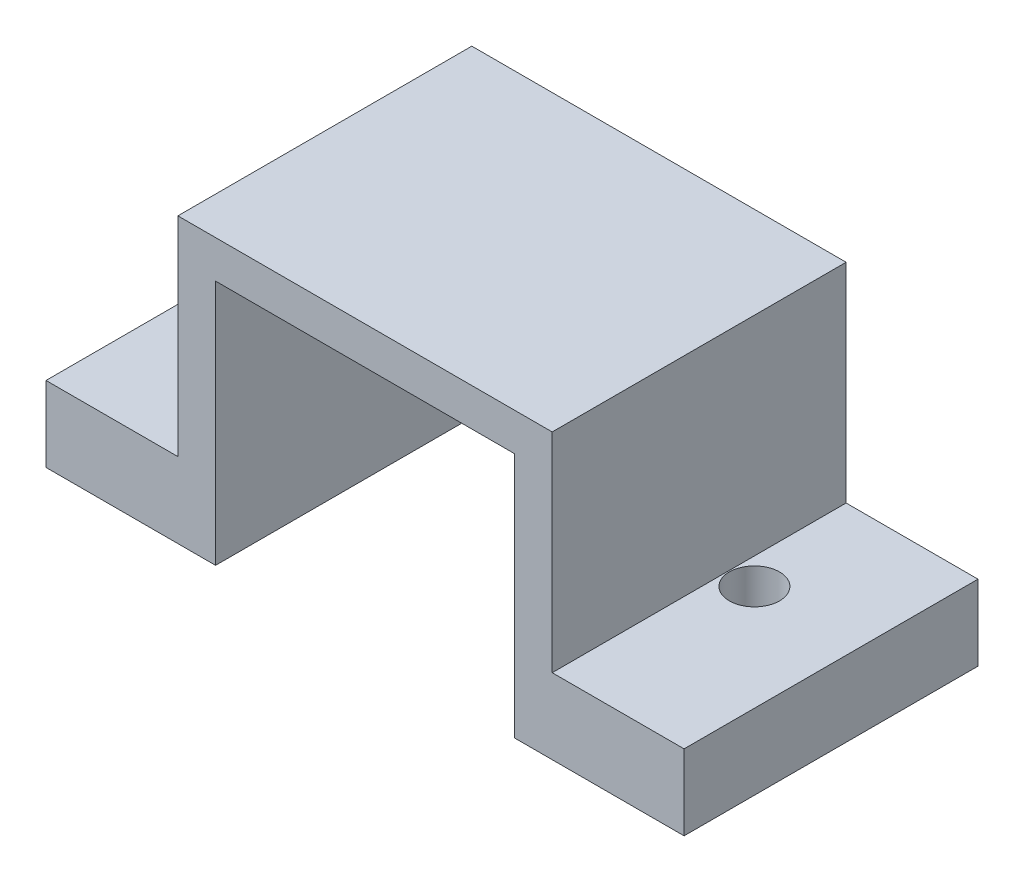
ISO-10303-21;
HEADER;
FILE_DESCRIPTION(('STEP AP214'),'2;1');
FILE_NAME('part.step','',(''),(''),'','','');
FILE_SCHEMA(('AUTOMOTIVE_DESIGN { 1 0 10303 214 1 1 1 1 }'));
ENDSEC;
DATA;
#1=APPLICATION_CONTEXT('core data for automotive mechanical design processes');
#2=APPLICATION_PROTOCOL_DEFINITION('international standard','automotive_design',2000,#1);
#3=PRODUCT_CONTEXT('',#1,'mechanical');
#4=PRODUCT('Part','Part','',(#3));
#5=PRODUCT_RELATED_PRODUCT_CATEGORY('part','',(#4));
#6=PRODUCT_DEFINITION_FORMATION('','',#4);
#7=PRODUCT_DEFINITION_CONTEXT('part definition',#1,'design');
#8=PRODUCT_DEFINITION('design','',#6,#7);
#9=PRODUCT_DEFINITION_SHAPE('','',#8);
#10=(LENGTH_UNIT() NAMED_UNIT(*) SI_UNIT(.MILLI.,.METRE.));
#11=(NAMED_UNIT(*) PLANE_ANGLE_UNIT() SI_UNIT($,.RADIAN.));
#12=(NAMED_UNIT(*) SI_UNIT($,.STERADIAN.) SOLID_ANGLE_UNIT());
#13=UNCERTAINTY_MEASURE_WITH_UNIT(LENGTH_MEASURE(1.E-05),#10,'distance_accuracy_value','');
#14=(GEOMETRIC_REPRESENTATION_CONTEXT(3) GLOBAL_UNCERTAINTY_ASSIGNED_CONTEXT((#13)) GLOBAL_UNIT_ASSIGNED_CONTEXT((#10,
#11,#12)) REPRESENTATION_CONTEXT('',''));
#15=CARTESIAN_POINT('',(0.,0.,0.));
#16=DIRECTION('',(0.,0.,1.));
#17=DIRECTION('',(1.,0.,0.));
#18=AXIS2_PLACEMENT_3D('',#15,#16,#17);
#19=CARTESIAN_POINT('',(0.,0.,11.7));
#20=DIRECTION('',(0.,1.,0.));
#21=DIRECTION('',(0.,0.,1.));
#22=AXIS2_PLACEMENT_3D('',#19,#20,#21);
#23=PLANE('',#22);
#24=CARTESIAN_POINT('',(4.19999999999999,0.,4.7));
#25=DIRECTION('',(0.,1.,0.));
#26=DIRECTION('',(0.,0.,1.));
#27=AXIS2_PLACEMENT_3D('',#24,#25,#26);
#28=CIRCLE('',#27,1.);
#29=CARTESIAN_POINT('',(4.19999999999999,0.,5.7));
#30=VERTEX_POINT('',#29);
#31=EDGE_CURVE('E221',#30,#30,#28,.T.);
#32=ORIENTED_EDGE('',*,*,#31,.T.);
#33=EDGE_LOOP('',(#32));
#34=FACE_BOUND('',#33,.T.);
#35=DIRECTION('',(1.,0.,0.));
#36=VECTOR('',#35,1.);
#37=CARTESIAN_POINT('',(0.,0.,0.));
#38=LINE('',#37,#36);
#39=CARTESIAN_POINT('',(0.,0.,0.));
#40=VERTEX_POINT('',#39);
#41=CARTESIAN_POINT('',(6.74999999999999,0.,0.));
#42=VERTEX_POINT('',#41);
#43=EDGE_CURVE('E137',#40,#42,#38,.T.);
#44=ORIENTED_EDGE('',*,*,#43,.T.);
#45=DIRECTION('',(0.,0.,1.));
#46=VECTOR('',#45,1.);
#47=CARTESIAN_POINT('',(6.74999999999999,0.,0.));
#48=LINE('',#47,#46);
#49=CARTESIAN_POINT('',(6.74999999999999,0.,11.7));
#50=VERTEX_POINT('',#49);
#51=EDGE_CURVE('E121',#42,#50,#48,.T.);
#52=ORIENTED_EDGE('',*,*,#51,.T.);
#53=DIRECTION('',(1.,0.,0.));
#54=VECTOR('',#53,1.);
#55=CARTESIAN_POINT('',(0.,0.,11.7));
#56=LINE('',#55,#54);
#57=CARTESIAN_POINT('',(0.,0.,11.7));
#58=VERTEX_POINT('',#57);
#59=EDGE_CURVE('E168',#58,#50,#56,.T.);
#60=ORIENTED_EDGE('',*,*,#59,.F.);
#61=DIRECTION('',(0.,0.,-1.));
#62=VECTOR('',#61,1.);
#63=CARTESIAN_POINT('',(0.,0.,11.7));
#64=LINE('',#63,#62);
#65=EDGE_CURVE('E11',#58,#40,#64,.T.);
#66=ORIENTED_EDGE('',*,*,#65,.T.);
#67=EDGE_LOOP('',(#44,#52,#60,#66));
#68=FACE_BOUND('',#67,.T.);
#69=ADVANCED_FACE('F32',(#34,#68),#23,.F.);
#70=CARTESIAN_POINT('',(0.,0.,11.7));
#71=DIRECTION('',(1.,0.,0.));
#72=DIRECTION('',(0.,1.,0.));
#73=AXIS2_PLACEMENT_3D('',#70,#71,#72);
#74=PLANE('',#73);
#75=DIRECTION('',(0.,0.,1.));
#76=VECTOR('',#75,1.);
#77=CARTESIAN_POINT('',(0.,3.,0.));
#78=LINE('',#77,#76);
#79=CARTESIAN_POINT('',(0.,3.,0.));
#80=VERTEX_POINT('',#79);
#81=CARTESIAN_POINT('',(0.,3.,11.7));
#82=VERTEX_POINT('',#81);
#83=EDGE_CURVE('E199',#80,#82,#78,.T.);
#84=ORIENTED_EDGE('',*,*,#83,.F.);
#85=DIRECTION('',(0.,-1.,0.));
#86=VECTOR('',#85,1.);
#87=CARTESIAN_POINT('',(0.,0.,0.));
#88=LINE('',#87,#86);
#89=EDGE_CURVE('E149',#80,#40,#88,.T.);
#90=ORIENTED_EDGE('',*,*,#89,.T.);
#91=ORIENTED_EDGE('',*,*,#65,.F.);
#92=DIRECTION('',(0.,-1.,0.));
#93=VECTOR('',#92,1.);
#94=CARTESIAN_POINT('',(0.,0.,11.7));
#95=LINE('',#94,#93);
#96=EDGE_CURVE('E154',#82,#58,#95,.T.);
#97=ORIENTED_EDGE('',*,*,#96,.F.);
#98=EDGE_LOOP('',(#84,#90,#91,#97));
#99=FACE_BOUND('',#98,.T.);
#100=ADVANCED_FACE('F34',(#99),#74,.F.);
#101=CARTESIAN_POINT('',(21.2,0.,4.7));
#102=DIRECTION('',(0.,1.,0.));
#103=DIRECTION('',(0.,0.,1.));
#104=AXIS2_PLACEMENT_3D('',#101,#102,#103);
#105=CIRCLE('',#104,1.);
#106=CARTESIAN_POINT('',(21.2,0.,5.7));
#107=VERTEX_POINT('',#106);
#108=EDGE_CURVE('E215',#107,#107,#105,.T.);
#109=ORIENTED_EDGE('',*,*,#108,.T.);
#110=EDGE_LOOP('',(#109));
#111=FACE_BOUND('',#110,.T.);
#112=CARTESIAN_POINT('',(18.65,0.,11.7));
#113=VERTEX_POINT('',#112);
#114=CARTESIAN_POINT('',(25.4,0.,11.7));
#115=VERTEX_POINT('',#114);
#116=EDGE_CURVE('E172',#113,#115,#56,.T.);
#117=ORIENTED_EDGE('',*,*,#116,.F.);
#118=DIRECTION('',(0.,0.,1.));
#119=VECTOR('',#118,1.);
#120=CARTESIAN_POINT('',(18.65,0.,0.));
#121=LINE('',#120,#119);
#122=CARTESIAN_POINT('',(18.65,0.,0.));
#123=VERTEX_POINT('',#122);
#124=EDGE_CURVE('E131',#123,#113,#121,.T.);
#125=ORIENTED_EDGE('',*,*,#124,.F.);
#126=CARTESIAN_POINT('',(25.4,0.,0.));
#127=VERTEX_POINT('',#126);
#128=EDGE_CURVE('E144',#123,#127,#38,.T.);
#129=ORIENTED_EDGE('',*,*,#128,.T.);
#130=DIRECTION('',(0.,0.,-1.));
#131=VECTOR('',#130,1.);
#132=CARTESIAN_POINT('',(25.4,0.,11.7));
#133=LINE('',#132,#131);
#134=EDGE_CURVE('E40',#115,#127,#133,.T.);
#135=ORIENTED_EDGE('',*,*,#134,.F.);
#136=EDGE_LOOP('',(#117,#125,#129,#135));
#137=FACE_BOUND('',#136,.T.);
#138=ADVANCED_FACE('F230',(#111,#137),#23,.F.);
#139=CARTESIAN_POINT('',(25.4,0.,11.7));
#140=DIRECTION('',(-1.,0.,0.));
#141=DIRECTION('',(0.,-1.,0.));
#142=AXIS2_PLACEMENT_3D('',#139,#140,#141);
#143=PLANE('',#142);
#144=DIRECTION('',(0.,1.,0.));
#145=VECTOR('',#144,1.);
#146=CARTESIAN_POINT('',(25.4,0.,0.));
#147=LINE('',#146,#145);
#148=CARTESIAN_POINT('',(25.4,3.,0.));
#149=VERTEX_POINT('',#148);
#150=EDGE_CURVE('E143',#127,#149,#147,.T.);
#151=ORIENTED_EDGE('',*,*,#150,.T.);
#152=DIRECTION('',(0.,0.,-1.));
#153=VECTOR('',#152,1.);
#154=CARTESIAN_POINT('',(25.4,3.,0.));
#155=LINE('',#154,#153);
#156=CARTESIAN_POINT('',(25.4,3.,11.7));
#157=VERTEX_POINT('',#156);
#158=EDGE_CURVE('E182',#157,#149,#155,.T.);
#159=ORIENTED_EDGE('',*,*,#158,.F.);
#160=DIRECTION('',(0.,1.,0.));
#161=VECTOR('',#160,1.);
#162=CARTESIAN_POINT('',(25.4,0.,11.7));
#163=LINE('',#162,#161);
#164=EDGE_CURVE('E162',#115,#157,#163,.T.);
#165=ORIENTED_EDGE('',*,*,#164,.F.);
#166=ORIENTED_EDGE('',*,*,#134,.T.);
#167=EDGE_LOOP('',(#151,#159,#165,#166));
#168=FACE_BOUND('',#167,.T.);
#169=ADVANCED_FACE('F252',(#168),#143,.F.);
#170=CARTESIAN_POINT('',(0.,11.3,11.7));
#171=DIRECTION('',(0.,-1.,0.));
#172=DIRECTION('',(0.,0.,-1.));
#173=AXIS2_PLACEMENT_3D('',#170,#171,#172);
#174=PLANE('',#173);
#175=DIRECTION('',(-1.,0.,0.));
#176=VECTOR('',#175,1.);
#177=CARTESIAN_POINT('',(0.,11.3,0.));
#178=LINE('',#177,#176);
#179=CARTESIAN_POINT('',(20.15,11.3,0.));
#180=VERTEX_POINT('',#179);
#181=CARTESIAN_POINT('',(5.24999999999999,11.3,0.));
#182=VERTEX_POINT('',#181);
#183=EDGE_CURVE('E147',#180,#182,#178,.T.);
#184=ORIENTED_EDGE('',*,*,#183,.T.);
#185=DIRECTION('',(0.,0.,-1.));
#186=VECTOR('',#185,1.);
#187=CARTESIAN_POINT('',(5.24999999999999,11.3,0.));
#188=LINE('',#187,#186);
#189=CARTESIAN_POINT('',(5.24999999999999,11.3,11.7));
#190=VERTEX_POINT('',#189);
#191=EDGE_CURVE('E179',#190,#182,#188,.T.);
#192=ORIENTED_EDGE('',*,*,#191,.F.);
#193=DIRECTION('',(-1.,0.,0.));
#194=VECTOR('',#193,1.);
#195=CARTESIAN_POINT('',(0.,11.3,11.7));
#196=LINE('',#195,#194);
#197=CARTESIAN_POINT('',(20.15,11.3,11.7));
#198=VERTEX_POINT('',#197);
#199=EDGE_CURVE('E156',#198,#190,#196,.T.);
#200=ORIENTED_EDGE('',*,*,#199,.F.);
#201=DIRECTION('',(0.,0.,1.));
#202=VECTOR('',#201,1.);
#203=CARTESIAN_POINT('',(20.15,11.3,0.));
#204=LINE('',#203,#202);
#205=EDGE_CURVE('E180',#180,#198,#204,.T.);
#206=ORIENTED_EDGE('',*,*,#205,.F.);
#207=EDGE_LOOP('',(#184,#192,#200,#206));
#208=FACE_BOUND('',#207,.T.);
#209=ADVANCED_FACE('F254',(#208),#174,.F.);
#210=CARTESIAN_POINT('',(0.,0.,11.7));
#211=DIRECTION('',(0.,0.,-1.));
#212=DIRECTION('',(-1.,0.,0.));
#213=AXIS2_PLACEMENT_3D('',#210,#211,#212);
#214=PLANE('',#213);
#215=ORIENTED_EDGE('',*,*,#59,.T.);
#216=DIRECTION('',(0.,-1.,0.));
#217=VECTOR('',#216,1.);
#218=CARTESIAN_POINT('',(6.74999999999999,9.8,11.7));
#219=LINE('',#218,#217);
#220=CARTESIAN_POINT('',(6.74999999999999,9.8,11.7));
#221=VERTEX_POINT('',#220);
#222=EDGE_CURVE('E126',#221,#50,#219,.T.);
#223=ORIENTED_EDGE('',*,*,#222,.F.);
#224=DIRECTION('',(-1.,0.,0.));
#225=VECTOR('',#224,1.);
#226=CARTESIAN_POINT('',(6.74999999999999,9.8,11.7));
#227=LINE('',#226,#225);
#228=CARTESIAN_POINT('',(18.65,9.8,11.7));
#229=VERTEX_POINT('',#228);
#230=EDGE_CURVE('E140',#229,#221,#227,.T.);
#231=ORIENTED_EDGE('',*,*,#230,.F.);
#232=DIRECTION('',(0.,1.,0.));
#233=VECTOR('',#232,1.);
#234=CARTESIAN_POINT('',(18.65,9.8,11.7));
#235=LINE('',#234,#233);
#236=EDGE_CURVE('E211',#113,#229,#235,.T.);
#237=ORIENTED_EDGE('',*,*,#236,.F.);
#238=ORIENTED_EDGE('',*,*,#116,.T.);
#239=ORIENTED_EDGE('',*,*,#164,.T.);
#240=DIRECTION('',(1.,0.,0.));
#241=VECTOR('',#240,1.);
#242=CARTESIAN_POINT('',(25.4,3.,11.7));
#243=LINE('',#242,#241);
#244=CARTESIAN_POINT('',(20.15,3.,11.7));
#245=VERTEX_POINT('',#244);
#246=EDGE_CURVE('E177',#245,#157,#243,.T.);
#247=ORIENTED_EDGE('',*,*,#246,.F.);
#248=DIRECTION('',(0.,1.,0.));
#249=VECTOR('',#248,1.);
#250=CARTESIAN_POINT('',(20.15,3.,11.7));
#251=LINE('',#250,#249);
#252=EDGE_CURVE('E176',#245,#198,#251,.T.);
#253=ORIENTED_EDGE('',*,*,#252,.T.);
#254=ORIENTED_EDGE('',*,*,#199,.T.);
#255=DIRECTION('',(0.,1.,0.));
#256=VECTOR('',#255,1.);
#257=CARTESIAN_POINT('',(5.24999999999999,3.,11.7));
#258=LINE('',#257,#256);
#259=CARTESIAN_POINT('',(5.24999999999999,3.,11.7));
#260=VERTEX_POINT('',#259);
#261=EDGE_CURVE('E192',#260,#190,#258,.T.);
#262=ORIENTED_EDGE('',*,*,#261,.F.);
#263=DIRECTION('',(1.,0.,0.));
#264=VECTOR('',#263,1.);
#265=CARTESIAN_POINT('',(0.,3.,11.7));
#266=LINE('',#265,#264);
#267=EDGE_CURVE('E202',#82,#260,#266,.T.);
#268=ORIENTED_EDGE('',*,*,#267,.F.);
#269=ORIENTED_EDGE('',*,*,#96,.T.);
#270=EDGE_LOOP('',(#215,#223,#231,#237,#238,#239,#247,#253,#254,#262,#268,#269));
#271=FACE_BOUND('',#270,.T.);
#272=ADVANCED_FACE('F260',(#271),#214,.F.);
#273=CARTESIAN_POINT('',(0.,0.,0.));
#274=DIRECTION('',(0.,0.,-1.));
#275=DIRECTION('',(-1.,0.,0.));
#276=AXIS2_PLACEMENT_3D('',#273,#274,#275);
#277=PLANE('',#276);
#278=DIRECTION('',(0.,-1.,0.));
#279=VECTOR('',#278,1.);
#280=CARTESIAN_POINT('',(6.74999999999999,9.8,0.));
#281=LINE('',#280,#279);
#282=CARTESIAN_POINT('',(6.74999999999999,9.8,0.));
#283=VERTEX_POINT('',#282);
#284=EDGE_CURVE('E124',#283,#42,#281,.T.);
#285=ORIENTED_EDGE('',*,*,#284,.T.);
#286=ORIENTED_EDGE('',*,*,#43,.F.);
#287=ORIENTED_EDGE('',*,*,#89,.F.);
#288=DIRECTION('',(-1.,0.,0.));
#289=VECTOR('',#288,1.);
#290=CARTESIAN_POINT('',(0.,3.,0.));
#291=LINE('',#290,#289);
#292=CARTESIAN_POINT('',(5.24999999999999,3.,0.));
#293=VERTEX_POINT('',#292);
#294=EDGE_CURVE('E195',#293,#80,#291,.T.);
#295=ORIENTED_EDGE('',*,*,#294,.F.);
#296=DIRECTION('',(0.,1.,0.));
#297=VECTOR('',#296,1.);
#298=CARTESIAN_POINT('',(5.24999999999999,3.,0.));
#299=LINE('',#298,#297);
#300=EDGE_CURVE('E194',#293,#182,#299,.T.);
#301=ORIENTED_EDGE('',*,*,#300,.T.);
#302=ORIENTED_EDGE('',*,*,#183,.F.);
#303=DIRECTION('',(0.,1.,0.));
#304=VECTOR('',#303,1.);
#305=CARTESIAN_POINT('',(20.15,3.,0.));
#306=LINE('',#305,#304);
#307=CARTESIAN_POINT('',(20.15,3.,0.));
#308=VERTEX_POINT('',#307);
#309=EDGE_CURVE('E174',#308,#180,#306,.T.);
#310=ORIENTED_EDGE('',*,*,#309,.F.);
#311=DIRECTION('',(-1.,0.,0.));
#312=VECTOR('',#311,1.);
#313=CARTESIAN_POINT('',(25.4,3.,0.));
#314=LINE('',#313,#312);
#315=EDGE_CURVE('E188',#149,#308,#314,.T.);
#316=ORIENTED_EDGE('',*,*,#315,.F.);
#317=ORIENTED_EDGE('',*,*,#150,.F.);
#318=ORIENTED_EDGE('',*,*,#128,.F.);
#319=DIRECTION('',(0.,1.,0.));
#320=VECTOR('',#319,1.);
#321=CARTESIAN_POINT('',(18.65,9.8,0.));
#322=LINE('',#321,#320);
#323=CARTESIAN_POINT('',(18.65,9.8,0.));
#324=VERTEX_POINT('',#323);
#325=EDGE_CURVE('E139',#123,#324,#322,.T.);
#326=ORIENTED_EDGE('',*,*,#325,.T.);
#327=DIRECTION('',(-1.,0.,0.));
#328=VECTOR('',#327,1.);
#329=CARTESIAN_POINT('',(6.74999999999999,9.8,0.));
#330=LINE('',#329,#328);
#331=EDGE_CURVE('E47',#324,#283,#330,.T.);
#332=ORIENTED_EDGE('',*,*,#331,.T.);
#333=EDGE_LOOP('',(#285,#286,#287,#295,#301,#302,#310,#316,#317,#318,#326,#332));
#334=FACE_BOUND('',#333,.T.);
#335=ADVANCED_FACE('F135',(#334),#277,.T.);
#336=CARTESIAN_POINT('',(20.15,3.,0.));
#337=DIRECTION('',(-1.,0.,0.));
#338=DIRECTION('',(0.,0.,1.));
#339=AXIS2_PLACEMENT_3D('',#336,#337,#338);
#340=PLANE('',#339);
#341=ORIENTED_EDGE('',*,*,#205,.T.);
#342=ORIENTED_EDGE('',*,*,#252,.F.);
#343=DIRECTION('',(0.,0.,1.));
#344=VECTOR('',#343,1.);
#345=CARTESIAN_POINT('',(20.15,3.,0.));
#346=LINE('',#345,#344);
#347=EDGE_CURVE('E185',#308,#245,#346,.T.);
#348=ORIENTED_EDGE('',*,*,#347,.F.);
#349=ORIENTED_EDGE('',*,*,#309,.T.);
#350=EDGE_LOOP('',(#341,#342,#348,#349));
#351=FACE_BOUND('',#350,.T.);
#352=ADVANCED_FACE('F244',(#351),#340,.F.);
#353=CARTESIAN_POINT('',(0.,3.,0.));
#354=DIRECTION('',(0.,-1.,0.));
#355=DIRECTION('',(0.,0.,-1.));
#356=AXIS2_PLACEMENT_3D('',#353,#354,#355);
#357=PLANE('',#356);
#358=CARTESIAN_POINT('',(21.2,3.,4.7));
#359=DIRECTION('',(0.,1.,0.));
#360=DIRECTION('',(0.,0.,1.));
#361=AXIS2_PLACEMENT_3D('',#358,#359,#360);
#362=CIRCLE('',#361,1.);
#363=CARTESIAN_POINT('',(21.2,3.,5.7));
#364=VERTEX_POINT('',#363);
#365=EDGE_CURVE('E224',#364,#364,#362,.T.);
#366=ORIENTED_EDGE('',*,*,#365,.F.);
#367=EDGE_LOOP('',(#366));
#368=FACE_BOUND('',#367,.T.);
#369=ORIENTED_EDGE('',*,*,#158,.T.);
#370=ORIENTED_EDGE('',*,*,#315,.T.);
#371=ORIENTED_EDGE('',*,*,#347,.T.);
#372=ORIENTED_EDGE('',*,*,#246,.T.);
#373=EDGE_LOOP('',(#369,#370,#371,#372));
#374=FACE_BOUND('',#373,.T.);
#375=ADVANCED_FACE('F240',(#368,#374),#357,.F.);
#376=CARTESIAN_POINT('',(5.24999999999999,3.,0.));
#377=DIRECTION('',(1.,0.,0.));
#378=DIRECTION('',(0.,0.,-1.));
#379=AXIS2_PLACEMENT_3D('',#376,#377,#378);
#380=PLANE('',#379);
#381=ORIENTED_EDGE('',*,*,#191,.T.);
#382=ORIENTED_EDGE('',*,*,#300,.F.);
#383=DIRECTION('',(0.,0.,-1.));
#384=VECTOR('',#383,1.);
#385=CARTESIAN_POINT('',(5.24999999999999,3.,0.));
#386=LINE('',#385,#384);
#387=EDGE_CURVE('E55',#260,#293,#386,.T.);
#388=ORIENTED_EDGE('',*,*,#387,.F.);
#389=ORIENTED_EDGE('',*,*,#261,.T.);
#390=EDGE_LOOP('',(#381,#382,#388,#389));
#391=FACE_BOUND('',#390,.T.);
#392=ADVANCED_FACE('F243',(#391),#380,.F.);
#393=CARTESIAN_POINT('',(0.,3.,0.));
#394=DIRECTION('',(0.,1.,0.));
#395=DIRECTION('',(0.,0.,1.));
#396=AXIS2_PLACEMENT_3D('',#393,#394,#395);
#397=PLANE('',#396);
#398=CARTESIAN_POINT('',(4.19999999999999,3.,4.7));
#399=DIRECTION('',(0.,1.,0.));
#400=DIRECTION('',(0.,0.,1.));
#401=AXIS2_PLACEMENT_3D('',#398,#399,#400);
#402=CIRCLE('',#401,1.);
#403=CARTESIAN_POINT('',(4.19999999999999,3.,5.7));
#404=VERTEX_POINT('',#403);
#405=EDGE_CURVE('E218',#404,#404,#402,.T.);
#406=ORIENTED_EDGE('',*,*,#405,.F.);
#407=EDGE_LOOP('',(#406));
#408=FACE_BOUND('',#407,.T.);
#409=ORIENTED_EDGE('',*,*,#83,.T.);
#410=ORIENTED_EDGE('',*,*,#267,.T.);
#411=ORIENTED_EDGE('',*,*,#387,.T.);
#412=ORIENTED_EDGE('',*,*,#294,.T.);
#413=EDGE_LOOP('',(#409,#410,#411,#412));
#414=FACE_BOUND('',#413,.T.);
#415=ADVANCED_FACE('F277',(#408,#414),#397,.T.);
#416=CARTESIAN_POINT('',(6.74999999999999,9.8,0.));
#417=DIRECTION('',(-1.,0.,0.));
#418=DIRECTION('',(0.,-1.,0.));
#419=AXIS2_PLACEMENT_3D('',#416,#417,#418);
#420=PLANE('',#419);
#421=ORIENTED_EDGE('',*,*,#222,.T.);
#422=ORIENTED_EDGE('',*,*,#51,.F.);
#423=ORIENTED_EDGE('',*,*,#284,.F.);
#424=DIRECTION('',(0.,0.,1.));
#425=VECTOR('',#424,1.);
#426=CARTESIAN_POINT('',(6.74999999999999,9.8,0.));
#427=LINE('',#426,#425);
#428=EDGE_CURVE('E183',#283,#221,#427,.T.);
#429=ORIENTED_EDGE('',*,*,#428,.T.);
#430=EDGE_LOOP('',(#421,#422,#423,#429));
#431=FACE_BOUND('',#430,.T.);
#432=ADVANCED_FACE('F123',(#431),#420,.F.);
#433=CARTESIAN_POINT('',(6.74999999999999,9.8,0.));
#434=DIRECTION('',(0.,1.,0.));
#435=DIRECTION('',(0.,0.,1.));
#436=AXIS2_PLACEMENT_3D('',#433,#434,#435);
#437=PLANE('',#436);
#438=ORIENTED_EDGE('',*,*,#230,.T.);
#439=ORIENTED_EDGE('',*,*,#428,.F.);
#440=ORIENTED_EDGE('',*,*,#331,.F.);
#441=DIRECTION('',(0.,0.,1.));
#442=VECTOR('',#441,1.);
#443=CARTESIAN_POINT('',(18.65,9.8,0.));
#444=LINE('',#443,#442);
#445=EDGE_CURVE('E206',#324,#229,#444,.T.);
#446=ORIENTED_EDGE('',*,*,#445,.T.);
#447=EDGE_LOOP('',(#438,#439,#440,#446));
#448=FACE_BOUND('',#447,.T.);
#449=ADVANCED_FACE('F293',(#448),#437,.F.);
#450=CARTESIAN_POINT('',(18.65,9.8,0.));
#451=DIRECTION('',(1.,0.,0.));
#452=DIRECTION('',(0.,0.,-1.));
#453=AXIS2_PLACEMENT_3D('',#450,#451,#452);
#454=PLANE('',#453);
#455=ORIENTED_EDGE('',*,*,#236,.T.);
#456=ORIENTED_EDGE('',*,*,#445,.F.);
#457=ORIENTED_EDGE('',*,*,#325,.F.);
#458=ORIENTED_EDGE('',*,*,#124,.T.);
#459=EDGE_LOOP('',(#455,#456,#457,#458));
#460=FACE_BOUND('',#459,.T.);
#461=ADVANCED_FACE('F273',(#460),#454,.F.);
#462=CARTESIAN_POINT('',(4.19999999999999,0.,4.7));
#463=DIRECTION('',(0.,1.,0.));
#464=DIRECTION('',(0.,0.,1.));
#465=AXIS2_PLACEMENT_3D('',#462,#463,#464);
#466=CYLINDRICAL_SURFACE('',#465,1.);
#467=ORIENTED_EDGE('',*,*,#31,.F.);
#468=EDGE_LOOP('',(#467));
#469=FACE_BOUND('',#468,.T.);
#470=ORIENTED_EDGE('',*,*,#405,.T.);
#471=EDGE_LOOP('',(#470));
#472=FACE_BOUND('',#471,.T.);
#473=ADVANCED_FACE('F236',(#469,#472),#466,.F.);
#474=CARTESIAN_POINT('',(21.2,0.,4.7));
#475=DIRECTION('',(0.,1.,0.));
#476=DIRECTION('',(0.,0.,1.));
#477=AXIS2_PLACEMENT_3D('',#474,#475,#476);
#478=CYLINDRICAL_SURFACE('',#477,1.);
#479=ORIENTED_EDGE('',*,*,#108,.F.);
#480=EDGE_LOOP('',(#479));
#481=FACE_BOUND('',#480,.T.);
#482=ORIENTED_EDGE('',*,*,#365,.T.);
#483=EDGE_LOOP('',(#482));
#484=FACE_BOUND('',#483,.T.);
#485=ADVANCED_FACE('F233',(#481,#484),#478,.F.);
#486=CLOSED_SHELL('',(#69,#100,#138,#169,#209,#272,#335,#352,#375,#392,#415,#432,#449,#461,#473,#485));
#487=MANIFOLD_SOLID_BREP('B2',#486);
#488=ADVANCED_BREP_SHAPE_REPRESENTATION('',(#18,#487),#14);
#489=SHAPE_DEFINITION_REPRESENTATION(#9,#488);
ENDSEC;
END-ISO-10303-21;
